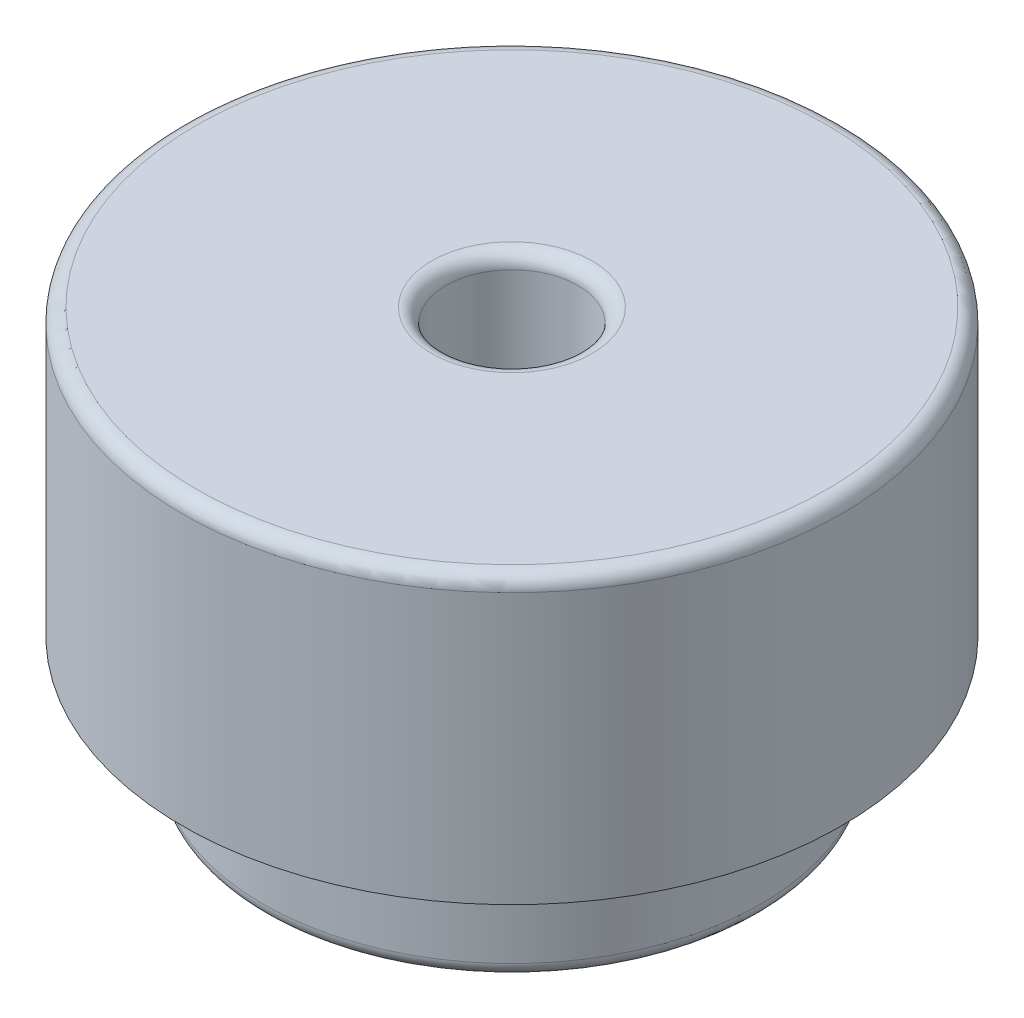
ISO-10303-21;
HEADER;
FILE_DESCRIPTION(('STEP AP214'),'2;1');
FILE_NAME('part.step','',(''),(''),'','','');
FILE_SCHEMA(('AUTOMOTIVE_DESIGN { 1 0 10303 214 1 1 1 1 }'));
ENDSEC;
DATA;
#1=APPLICATION_CONTEXT('core data for automotive mechanical design processes');
#2=APPLICATION_PROTOCOL_DEFINITION('international standard','automotive_design',2000,#1);
#3=PRODUCT_CONTEXT('',#1,'mechanical');
#4=PRODUCT('Part','Part','',(#3));
#5=PRODUCT_RELATED_PRODUCT_CATEGORY('part','',(#4));
#6=PRODUCT_DEFINITION_FORMATION('','',#4);
#7=PRODUCT_DEFINITION_CONTEXT('part definition',#1,'design');
#8=PRODUCT_DEFINITION('design','',#6,#7);
#9=PRODUCT_DEFINITION_SHAPE('','',#8);
#10=(LENGTH_UNIT() NAMED_UNIT(*) SI_UNIT(.MILLI.,.METRE.));
#11=(NAMED_UNIT(*) PLANE_ANGLE_UNIT() SI_UNIT($,.RADIAN.));
#12=(NAMED_UNIT(*) SI_UNIT($,.STERADIAN.) SOLID_ANGLE_UNIT());
#13=UNCERTAINTY_MEASURE_WITH_UNIT(LENGTH_MEASURE(1.E-05),#10,'distance_accuracy_value','');
#14=(GEOMETRIC_REPRESENTATION_CONTEXT(3) GLOBAL_UNCERTAINTY_ASSIGNED_CONTEXT((#13)) GLOBAL_UNIT_ASSIGNED_CONTEXT((#10,
#11,#12)) REPRESENTATION_CONTEXT('',''));
#15=CARTESIAN_POINT('',(0.,0.,0.));
#16=DIRECTION('',(0.,0.,1.));
#17=DIRECTION('',(1.,0.,0.));
#18=AXIS2_PLACEMENT_3D('',#15,#16,#17);
#19=CARTESIAN_POINT('',(0.,-8.03333332871882,0.));
#20=DIRECTION('',(0.,-1.,0.));
#21=DIRECTION('',(0.,0.,-1.));
#22=AXIS2_PLACEMENT_3D('',#19,#20,#21);
#23=TOROIDAL_SURFACE('',#22,5.96724285714286,1.05714285714286);
#24=CARTESIAN_POINT('',(0.,-9.09047618586168,0.));
#25=DIRECTION('',(0.,-1.,0.));
#26=DIRECTION('',(0.,0.,-1.));
#27=AXIS2_PLACEMENT_3D('',#24,#25,#26);
#28=CIRCLE('',#27,5.96724285714286);
#29=CARTESIAN_POINT('',(0.,-9.09047618586168,-5.96724285714286));
#30=VERTEX_POINT('',#29);
#31=EDGE_CURVE('E10',#30,#30,#28,.T.);
#32=ORIENTED_EDGE('',*,*,#31,.T.);
#33=EDGE_LOOP('',(#32));
#34=FACE_BOUND('',#33,.T.);
#35=CARTESIAN_POINT('',(0.,-8.03333332871882,0.));
#36=DIRECTION('',(0.,-1.,0.));
#37=DIRECTION('',(0.,0.,-1.));
#38=AXIS2_PLACEMENT_3D('',#35,#36,#37);
#39=CIRCLE('',#38,4.9101);
#40=CARTESIAN_POINT('',(0.,-8.03333332871882,-4.9101));
#41=VERTEX_POINT('',#40);
#42=EDGE_CURVE('E67',#41,#41,#39,.T.);
#43=ORIENTED_EDGE('',*,*,#42,.F.);
#44=EDGE_LOOP('',(#43));
#45=FACE_BOUND('',#44,.T.);
#46=ADVANCED_FACE('F30',(#34,#45),#23,.T.);
#47=CARTESIAN_POINT('',(5.96724285714286,-9.09047618586168,0.));
#48=DIRECTION('',(0.,-1.,0.));
#49=DIRECTION('',(0.,0.,-1.));
#50=AXIS2_PLACEMENT_3D('',#47,#48,#49);
#51=PLANE('',#50);
#52=CARTESIAN_POINT('',(0.,-9.09047618586168,0.));
#53=DIRECTION('',(0.,-1.,0.));
#54=DIRECTION('',(0.,0.,-1.));
#55=AXIS2_PLACEMENT_3D('',#52,#53,#54);
#56=CIRCLE('',#55,17.4428571428572);
#57=CARTESIAN_POINT('',(0.,-9.09047618586168,-17.4428571428572));
#58=VERTEX_POINT('',#57);
#59=EDGE_CURVE('E36',#58,#58,#56,.T.);
#60=ORIENTED_EDGE('',*,*,#59,.T.);
#61=EDGE_LOOP('',(#60));
#62=FACE_BOUND('',#61,.T.);
#63=ORIENTED_EDGE('',*,*,#31,.F.);
#64=EDGE_LOOP('',(#63));
#65=FACE_BOUND('',#64,.T.);
#66=ADVANCED_FACE('F75',(#62,#65),#51,.T.);
#67=CARTESIAN_POINT('',(0.,-8.03333332871882,0.));
#68=DIRECTION('',(0.,-1.,0.));
#69=DIRECTION('',(0.,0.,-1.));
#70=AXIS2_PLACEMENT_3D('',#67,#68,#69);
#71=TOROIDAL_SURFACE('',#70,17.4428571428571,1.05714285714286);
#72=CARTESIAN_POINT('',(0.,-8.03333332871882,0.));
#73=DIRECTION('',(0.,-1.,0.));
#74=DIRECTION('',(0.,0.,-1.));
#75=AXIS2_PLACEMENT_3D('',#72,#73,#74);
#76=CIRCLE('',#75,18.5);
#77=CARTESIAN_POINT('',(0.,-8.03333332871882,-18.5));
#78=VERTEX_POINT('',#77);
#79=EDGE_CURVE('E40',#78,#78,#76,.T.);
#80=ORIENTED_EDGE('',*,*,#79,.T.);
#81=EDGE_LOOP('',(#80));
#82=FACE_BOUND('',#81,.T.);
#83=ORIENTED_EDGE('',*,*,#59,.F.);
#84=EDGE_LOOP('',(#83));
#85=FACE_BOUND('',#84,.T.);
#86=ADVANCED_FACE('F79',(#82,#85),#71,.T.);
#87=CARTESIAN_POINT('',(0.,0.,0.));
#88=DIRECTION('',(0.,-1.,0.));
#89=DIRECTION('',(0.,0.,-1.));
#90=AXIS2_PLACEMENT_3D('',#87,#88,#89);
#91=CYLINDRICAL_SURFACE('',#90,18.5);
#92=CARTESIAN_POINT('',(0.,-0.441146179401993,0.));
#93=DIRECTION('',(0.,-1.,0.));
#94=DIRECTION('',(0.,0.,-1.));
#95=AXIS2_PLACEMENT_3D('',#92,#93,#94);
#96=CIRCLE('',#95,18.5);
#97=CARTESIAN_POINT('',(0.,-0.441146179401993,-18.5));
#98=VERTEX_POINT('',#97);
#99=EDGE_CURVE('E44',#98,#98,#96,.T.);
#100=ORIENTED_EDGE('',*,*,#99,.T.);
#101=EDGE_LOOP('',(#100));
#102=FACE_BOUND('',#101,.T.);
#103=ORIENTED_EDGE('',*,*,#79,.F.);
#104=EDGE_LOOP('',(#103));
#105=FACE_BOUND('',#104,.T.);
#106=ADVANCED_FACE('F83',(#102,#105),#91,.T.);
#107=CARTESIAN_POINT('',(0.,-0.441146179401993,0.));
#108=DIRECTION('',(0.,-1.,0.));
#109=DIRECTION('',(0.,0.,-1.));
#110=AXIS2_PLACEMENT_3D('',#107,#108,#109);
#111=TOROIDAL_SURFACE('',#110,18.941146179402,0.441146179401993);
#112=CARTESIAN_POINT('',(0.,0.,0.));
#113=DIRECTION('',(0.,-1.,0.));
#114=DIRECTION('',(0.,0.,-1.));
#115=AXIS2_PLACEMENT_3D('',#112,#113,#114);
#116=CIRCLE('',#115,18.941146179402);
#117=CARTESIAN_POINT('',(0.,0.,-18.941146179402));
#118=VERTEX_POINT('',#117);
#119=EDGE_CURVE('E49',#118,#118,#116,.T.);
#120=ORIENTED_EDGE('',*,*,#119,.T.);
#121=EDGE_LOOP('',(#120));
#122=FACE_BOUND('',#121,.T.);
#123=ORIENTED_EDGE('',*,*,#99,.F.);
#124=EDGE_LOOP('',(#123));
#125=FACE_BOUND('',#124,.T.);
#126=ADVANCED_FACE('F90',(#122,#125),#111,.F.);
#127=CARTESIAN_POINT('',(18.941146179402,0.,0.));
#128=DIRECTION('',(0.,-1.,0.));
#129=DIRECTION('',(0.,0.,-1.));
#130=AXIS2_PLACEMENT_3D('',#127,#128,#129);
#131=PLANE('',#130);
#132=CARTESIAN_POINT('',(0.,0.,0.));
#133=DIRECTION('',(0.,-1.,0.));
#134=DIRECTION('',(0.,0.,-1.));
#135=AXIS2_PLACEMENT_3D('',#132,#133,#134);
#136=CIRCLE('',#135,24.5);
#137=CARTESIAN_POINT('',(0.,0.,-24.5));
#138=VERTEX_POINT('',#137);
#139=EDGE_CURVE('E52',#138,#138,#136,.T.);
#140=ORIENTED_EDGE('',*,*,#139,.T.);
#141=EDGE_LOOP('',(#140));
#142=FACE_BOUND('',#141,.T.);
#143=ORIENTED_EDGE('',*,*,#119,.F.);
#144=EDGE_LOOP('',(#143));
#145=FACE_BOUND('',#144,.T.);
#146=ADVANCED_FACE('F94',(#142,#145),#131,.T.);
#147=CARTESIAN_POINT('',(0.,0.,0.));
#148=DIRECTION('',(0.,-1.,0.));
#149=DIRECTION('',(0.,0.,-1.));
#150=AXIS2_PLACEMENT_3D('',#147,#148,#149);
#151=CYLINDRICAL_SURFACE('',#150,24.5);
#152=CARTESIAN_POINT('',(0.,20.0857142857143,0.));
#153=DIRECTION('',(0.,-1.,0.));
#154=DIRECTION('',(0.,0.,-1.));
#155=AXIS2_PLACEMENT_3D('',#152,#153,#154);
#156=CIRCLE('',#155,24.5);
#157=CARTESIAN_POINT('',(0.,20.0857142857143,-24.5));
#158=VERTEX_POINT('',#157);
#159=EDGE_CURVE('E55',#158,#158,#156,.T.);
#160=ORIENTED_EDGE('',*,*,#159,.T.);
#161=EDGE_LOOP('',(#160));
#162=FACE_BOUND('',#161,.T.);
#163=ORIENTED_EDGE('',*,*,#139,.F.);
#164=EDGE_LOOP('',(#163));
#165=FACE_BOUND('',#164,.T.);
#166=ADVANCED_FACE('F98',(#162,#165),#151,.T.);
#167=CARTESIAN_POINT('',(0.,20.0857142857143,0.));
#168=DIRECTION('',(0.,-1.,0.));
#169=DIRECTION('',(0.,0.,-1.));
#170=AXIS2_PLACEMENT_3D('',#167,#168,#169);
#171=TOROIDAL_SURFACE('',#170,23.4428571428571,1.05714285714285);
#172=CARTESIAN_POINT('',(0.,21.1428571428571,0.));
#173=DIRECTION('',(0.,-1.,0.));
#174=DIRECTION('',(0.,0.,-1.));
#175=AXIS2_PLACEMENT_3D('',#172,#173,#174);
#176=CIRCLE('',#175,23.4428571428571);
#177=CARTESIAN_POINT('',(0.,21.1428571428571,-23.4428571428571));
#178=VERTEX_POINT('',#177);
#179=EDGE_CURVE('E58',#178,#178,#176,.T.);
#180=ORIENTED_EDGE('',*,*,#179,.T.);
#181=EDGE_LOOP('',(#180));
#182=FACE_BOUND('',#181,.T.);
#183=ORIENTED_EDGE('',*,*,#159,.F.);
#184=EDGE_LOOP('',(#183));
#185=FACE_BOUND('',#184,.T.);
#186=ADVANCED_FACE('F102',(#182,#185),#171,.T.);
#187=CARTESIAN_POINT('',(5.96724285714286,21.1428571428571,0.));
#188=DIRECTION('',(0.,1.,0.));
#189=DIRECTION('',(0.,0.,1.));
#190=AXIS2_PLACEMENT_3D('',#187,#188,#189);
#191=PLANE('',#190);
#192=CARTESIAN_POINT('',(0.,21.1428571428571,0.));
#193=DIRECTION('',(0.,-1.,0.));
#194=DIRECTION('',(0.,0.,-1.));
#195=AXIS2_PLACEMENT_3D('',#192,#193,#194);
#196=CIRCLE('',#195,5.96724285714286);
#197=CARTESIAN_POINT('',(0.,21.1428571428571,-5.96724285714286));
#198=VERTEX_POINT('',#197);
#199=EDGE_CURVE('E61',#198,#198,#196,.T.);
#200=ORIENTED_EDGE('',*,*,#199,.T.);
#201=EDGE_LOOP('',(#200));
#202=FACE_BOUND('',#201,.T.);
#203=ORIENTED_EDGE('',*,*,#179,.F.);
#204=EDGE_LOOP('',(#203));
#205=FACE_BOUND('',#204,.T.);
#206=ADVANCED_FACE('F106',(#202,#205),#191,.T.);
#207=CARTESIAN_POINT('',(0.,20.0857142857143,0.));
#208=DIRECTION('',(0.,-1.,0.));
#209=DIRECTION('',(0.,0.,-1.));
#210=AXIS2_PLACEMENT_3D('',#207,#208,#209);
#211=TOROIDAL_SURFACE('',#210,5.96724285714286,1.05714285714286);
#212=CARTESIAN_POINT('',(0.,20.0857142857143,0.));
#213=DIRECTION('',(0.,-1.,0.));
#214=DIRECTION('',(0.,0.,-1.));
#215=AXIS2_PLACEMENT_3D('',#212,#213,#214);
#216=CIRCLE('',#215,4.9101);
#217=CARTESIAN_POINT('',(0.,20.0857142857143,-4.9101));
#218=VERTEX_POINT('',#217);
#219=EDGE_CURVE('E64',#218,#218,#216,.T.);
#220=ORIENTED_EDGE('',*,*,#219,.T.);
#221=EDGE_LOOP('',(#220));
#222=FACE_BOUND('',#221,.T.);
#223=ORIENTED_EDGE('',*,*,#199,.F.);
#224=EDGE_LOOP('',(#223));
#225=FACE_BOUND('',#224,.T.);
#226=ADVANCED_FACE('F110',(#222,#225),#211,.T.);
#227=CARTESIAN_POINT('',(0.,0.,0.));
#228=DIRECTION('',(0.,-1.,0.));
#229=DIRECTION('',(0.,0.,-1.));
#230=AXIS2_PLACEMENT_3D('',#227,#228,#229);
#231=CYLINDRICAL_SURFACE('',#230,4.9101);
#232=ORIENTED_EDGE('',*,*,#42,.T.);
#233=EDGE_LOOP('',(#232));
#234=FACE_BOUND('',#233,.T.);
#235=ORIENTED_EDGE('',*,*,#219,.F.);
#236=EDGE_LOOP('',(#235));
#237=FACE_BOUND('',#236,.T.);
#238=ADVANCED_FACE('F71',(#234,#237),#231,.F.);
#239=CLOSED_SHELL('',(#46,#66,#86,#106,#126,#146,#166,#186,#206,#226,#238));
#240=MANIFOLD_SOLID_BREP('B2',#239);
#241=ADVANCED_BREP_SHAPE_REPRESENTATION('',(#18,#240),#14);
#242=SHAPE_DEFINITION_REPRESENTATION(#9,#241);
ENDSEC;
END-ISO-10303-21;
